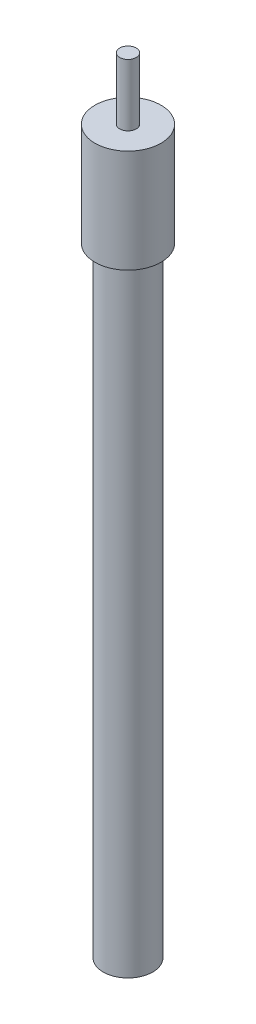
ISO-10303-21;
HEADER;
FILE_DESCRIPTION(('STEP AP214'),'2;1');
FILE_NAME('part.step','',(''),(''),'','','');
FILE_SCHEMA(('AUTOMOTIVE_DESIGN { 1 0 10303 214 1 1 1 1 }'));
ENDSEC;
DATA;
#1=APPLICATION_CONTEXT('core data for automotive mechanical design processes');
#2=APPLICATION_PROTOCOL_DEFINITION('international standard','automotive_design',2000,#1);
#3=PRODUCT_CONTEXT('',#1,'mechanical');
#4=PRODUCT('Part','Part','',(#3));
#5=PRODUCT_RELATED_PRODUCT_CATEGORY('part','',(#4));
#6=PRODUCT_DEFINITION_FORMATION('','',#4);
#7=PRODUCT_DEFINITION_CONTEXT('part definition',#1,'design');
#8=PRODUCT_DEFINITION('design','',#6,#7);
#9=PRODUCT_DEFINITION_SHAPE('','',#8);
#10=(LENGTH_UNIT() NAMED_UNIT(*) SI_UNIT(.MILLI.,.METRE.));
#11=(NAMED_UNIT(*) PLANE_ANGLE_UNIT() SI_UNIT($,.RADIAN.));
#12=(NAMED_UNIT(*) SI_UNIT($,.STERADIAN.) SOLID_ANGLE_UNIT());
#13=UNCERTAINTY_MEASURE_WITH_UNIT(LENGTH_MEASURE(1.E-05),#10,'distance_accuracy_value','');
#14=(GEOMETRIC_REPRESENTATION_CONTEXT(3) GLOBAL_UNCERTAINTY_ASSIGNED_CONTEXT((#13)) GLOBAL_UNIT_ASSIGNED_CONTEXT((#10,
#11,#12)) REPRESENTATION_CONTEXT('',''));
#15=CARTESIAN_POINT('',(0.,0.,0.));
#16=DIRECTION('',(0.,0.,1.));
#17=DIRECTION('',(1.,0.,0.));
#18=AXIS2_PLACEMENT_3D('',#15,#16,#17);
#19=CARTESIAN_POINT('',(0.,150.,0.));
#20=DIRECTION('',(0.,-1.,0.));
#21=DIRECTION('',(0.,0.,-1.));
#22=AXIS2_PLACEMENT_3D('',#19,#20,#21);
#23=CYLINDRICAL_SURFACE('',#22,6.);
#24=CARTESIAN_POINT('',(0.,150.,0.));
#25=DIRECTION('',(0.,1.,0.));
#26=DIRECTION('',(0.,0.,1.));
#27=AXIS2_PLACEMENT_3D('',#24,#25,#26);
#28=CIRCLE('',#27,6.);
#29=CARTESIAN_POINT('',(0.,150.,6.));
#30=VERTEX_POINT('',#29);
#31=EDGE_CURVE('E55',#30,#30,#28,.T.);
#32=ORIENTED_EDGE('',*,*,#31,.F.);
#33=EDGE_LOOP('',(#32));
#34=FACE_BOUND('',#33,.T.);
#35=CARTESIAN_POINT('',(0.,0.,0.));
#36=DIRECTION('',(0.,1.,0.));
#37=DIRECTION('',(0.,0.,1.));
#38=AXIS2_PLACEMENT_3D('',#35,#36,#37);
#39=CIRCLE('',#38,6.);
#40=CARTESIAN_POINT('',(0.,0.,6.));
#41=VERTEX_POINT('',#40);
#42=EDGE_CURVE('E48',#41,#41,#39,.T.);
#43=ORIENTED_EDGE('',*,*,#42,.T.);
#44=EDGE_LOOP('',(#43));
#45=FACE_BOUND('',#44,.T.);
#46=ADVANCED_FACE('F44',(#34,#45),#23,.T.);
#47=CARTESIAN_POINT('',(0.,0.,0.));
#48=DIRECTION('',(0.,1.,0.));
#49=DIRECTION('',(0.,0.,1.));
#50=AXIS2_PLACEMENT_3D('',#47,#48,#49);
#51=PLANE('',#50);
#52=ORIENTED_EDGE('',*,*,#42,.F.);
#53=EDGE_LOOP('',(#52));
#54=FACE_BOUND('',#53,.T.);
#55=ADVANCED_FACE('F88',(#54),#51,.F.);
#56=CARTESIAN_POINT('',(0.,175.,0.));
#57=DIRECTION('',(0.,-1.,0.));
#58=DIRECTION('',(0.,0.,-1.));
#59=AXIS2_PLACEMENT_3D('',#56,#57,#58);
#60=CYLINDRICAL_SURFACE('',#59,8.);
#61=CARTESIAN_POINT('',(0.,175.,0.));
#62=DIRECTION('',(0.,1.,0.));
#63=DIRECTION('',(0.,0.,1.));
#64=AXIS2_PLACEMENT_3D('',#61,#62,#63);
#65=CIRCLE('',#64,8.);
#66=CARTESIAN_POINT('',(0.,175.,8.));
#67=VERTEX_POINT('',#66);
#68=EDGE_CURVE('E58',#67,#67,#65,.T.);
#69=ORIENTED_EDGE('',*,*,#68,.F.);
#70=EDGE_LOOP('',(#69));
#71=FACE_BOUND('',#70,.T.);
#72=CARTESIAN_POINT('',(0.,150.,0.));
#73=DIRECTION('',(0.,1.,0.));
#74=DIRECTION('',(0.,0.,1.));
#75=AXIS2_PLACEMENT_3D('',#72,#73,#74);
#76=CIRCLE('',#75,8.);
#77=CARTESIAN_POINT('',(0.,150.,8.));
#78=VERTEX_POINT('',#77);
#79=EDGE_CURVE('E61',#78,#78,#76,.T.);
#80=ORIENTED_EDGE('',*,*,#79,.T.);
#81=EDGE_LOOP('',(#80));
#82=FACE_BOUND('',#81,.T.);
#83=ADVANCED_FACE('F95',(#71,#82),#60,.T.);
#84=CARTESIAN_POINT('',(0.,175.,0.));
#85=DIRECTION('',(0.,1.,0.));
#86=DIRECTION('',(0.,0.,1.));
#87=AXIS2_PLACEMENT_3D('',#84,#85,#86);
#88=PLANE('',#87);
#89=CARTESIAN_POINT('',(0.,175.,0.));
#90=DIRECTION('',(0.,1.,0.));
#91=DIRECTION('',(0.,0.,1.));
#92=AXIS2_PLACEMENT_3D('',#89,#90,#91);
#93=CIRCLE('',#92,2.);
#94=CARTESIAN_POINT('',(0.,175.,2.));
#95=VERTEX_POINT('',#94);
#96=EDGE_CURVE('E10',#95,#95,#93,.T.);
#97=ORIENTED_EDGE('',*,*,#96,.F.);
#98=EDGE_LOOP('',(#97));
#99=FACE_BOUND('',#98,.T.);
#100=ORIENTED_EDGE('',*,*,#68,.T.);
#101=EDGE_LOOP('',(#100));
#102=FACE_BOUND('',#101,.T.);
#103=ADVANCED_FACE('F82',(#99,#102),#88,.T.);
#104=CARTESIAN_POINT('',(0.,150.,0.));
#105=DIRECTION('',(0.,1.,0.));
#106=DIRECTION('',(0.,0.,1.));
#107=AXIS2_PLACEMENT_3D('',#104,#105,#106);
#108=PLANE('',#107);
#109=ORIENTED_EDGE('',*,*,#31,.T.);
#110=EDGE_LOOP('',(#109));
#111=FACE_BOUND('',#110,.T.);
#112=ORIENTED_EDGE('',*,*,#79,.F.);
#113=EDGE_LOOP('',(#112));
#114=FACE_BOUND('',#113,.T.);
#115=ADVANCED_FACE('F74',(#111,#114),#108,.F.);
#116=CARTESIAN_POINT('',(0.,190.,0.));
#117=DIRECTION('',(0.,-1.,0.));
#118=DIRECTION('',(0.,0.,-1.));
#119=AXIS2_PLACEMENT_3D('',#116,#117,#118);
#120=CYLINDRICAL_SURFACE('',#119,2.);
#121=CARTESIAN_POINT('',(0.,190.,0.));
#122=DIRECTION('',(0.,1.,0.));
#123=DIRECTION('',(0.,0.,1.));
#124=AXIS2_PLACEMENT_3D('',#121,#122,#123);
#125=CIRCLE('',#124,2.);
#126=CARTESIAN_POINT('',(0.,190.,2.));
#127=VERTEX_POINT('',#126);
#128=EDGE_CURVE('E56',#127,#127,#125,.T.);
#129=ORIENTED_EDGE('',*,*,#128,.F.);
#130=EDGE_LOOP('',(#129));
#131=FACE_BOUND('',#130,.T.);
#132=ORIENTED_EDGE('',*,*,#96,.T.);
#133=EDGE_LOOP('',(#132));
#134=FACE_BOUND('',#133,.T.);
#135=ADVANCED_FACE('F75',(#131,#134),#120,.T.);
#136=CARTESIAN_POINT('',(0.,190.,0.));
#137=DIRECTION('',(0.,1.,0.));
#138=DIRECTION('',(0.,0.,1.));
#139=AXIS2_PLACEMENT_3D('',#136,#137,#138);
#140=PLANE('',#139);
#141=ORIENTED_EDGE('',*,*,#128,.T.);
#142=EDGE_LOOP('',(#141));
#143=FACE_BOUND('',#142,.T.);
#144=ADVANCED_FACE('F68',(#143),#140,.T.);
#145=CLOSED_SHELL('',(#46,#55,#83,#103,#115,#135,#144));
#146=MANIFOLD_SOLID_BREP('B2',#145);
#147=ADVANCED_BREP_SHAPE_REPRESENTATION('',(#18,#146),#14);
#148=SHAPE_DEFINITION_REPRESENTATION(#9,#147);
ENDSEC;
END-ISO-10303-21;
